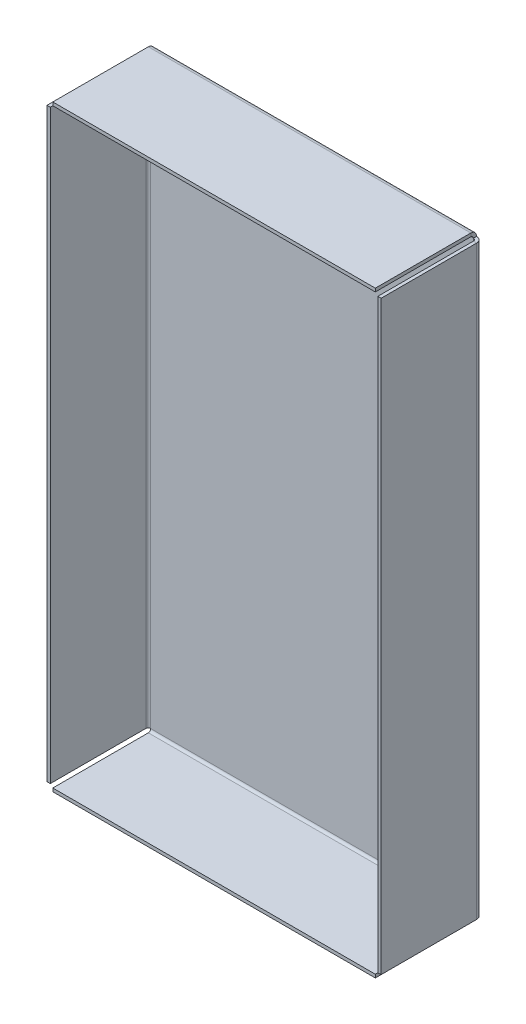
ISO-10303-21;
HEADER;
FILE_DESCRIPTION(('STEP AP214'),'2;1');
FILE_NAME('part.step','',(''),(''),'','','');
FILE_SCHEMA(('AUTOMOTIVE_DESIGN { 1 0 10303 214 1 1 1 1 }'));
ENDSEC;
DATA;
#1=APPLICATION_CONTEXT('core data for automotive mechanical design processes');
#2=APPLICATION_PROTOCOL_DEFINITION('international standard','automotive_design',2000,#1);
#3=PRODUCT_CONTEXT('',#1,'mechanical');
#4=PRODUCT('Part','Part','',(#3));
#5=PRODUCT_RELATED_PRODUCT_CATEGORY('part','',(#4));
#6=PRODUCT_DEFINITION_FORMATION('','',#4);
#7=PRODUCT_DEFINITION_CONTEXT('part definition',#1,'design');
#8=PRODUCT_DEFINITION('design','',#6,#7);
#9=PRODUCT_DEFINITION_SHAPE('','',#8);
#10=(LENGTH_UNIT() NAMED_UNIT(*) SI_UNIT(.MILLI.,.METRE.));
#11=(NAMED_UNIT(*) PLANE_ANGLE_UNIT() SI_UNIT($,.RADIAN.));
#12=(NAMED_UNIT(*) SI_UNIT($,.STERADIAN.) SOLID_ANGLE_UNIT());
#13=UNCERTAINTY_MEASURE_WITH_UNIT(LENGTH_MEASURE(1.E-05),#10,'distance_accuracy_value','');
#14=(GEOMETRIC_REPRESENTATION_CONTEXT(3) GLOBAL_UNCERTAINTY_ASSIGNED_CONTEXT((#13)) GLOBAL_UNIT_ASSIGNED_CONTEXT((#10,
#11,#12)) REPRESENTATION_CONTEXT('',''));
#15=CARTESIAN_POINT('',(0.,0.,0.));
#16=DIRECTION('',(0.,0.,1.));
#17=DIRECTION('',(1.,0.,0.));
#18=AXIS2_PLACEMENT_3D('',#15,#16,#17);
#19=CARTESIAN_POINT('',(0.,0.,-1.));
#20=DIRECTION('',(0.,0.,-1.));
#21=DIRECTION('',(-1.,0.,0.));
#22=AXIS2_PLACEMENT_3D('',#19,#20,#21);
#23=PLANE('',#22);
#24=DIRECTION('',(-1.,0.,0.));
#25=VECTOR('',#24,1.);
#26=CARTESIAN_POINT('',(160.,209.,-1.));
#27=LINE('',#26,#25);
#28=CARTESIAN_POINT('',(129.028776631143,209.,-1.));
#29=VERTEX_POINT('',#28);
#30=CARTESIAN_POINT('',(129.,209.,-1.));
#31=VERTEX_POINT('',#30);
#32=EDGE_CURVE('E61',#29,#31,#27,.T.);
#33=ORIENTED_EDGE('',*,*,#32,.F.);
#34=DIRECTION('',(0.,-1.,0.));
#35=VECTOR('',#34,1.);
#36=CARTESIAN_POINT('',(129.028776631143,0.,-1.));
#37=LINE('',#36,#35);
#38=CARTESIAN_POINT('',(129.028776631143,31.,-1.));
#39=VERTEX_POINT('',#38);
#40=EDGE_CURVE('E483',#29,#39,#37,.T.);
#41=ORIENTED_EDGE('',*,*,#40,.T.);
#42=DIRECTION('',(1.,0.,0.));
#43=VECTOR('',#42,1.);
#44=CARTESIAN_POINT('',(160.,31.,-1.));
#45=LINE('',#44,#43);
#46=CARTESIAN_POINT('',(129.,31.,-1.));
#47=VERTEX_POINT('',#46);
#48=EDGE_CURVE('E429',#47,#39,#45,.T.);
#49=ORIENTED_EDGE('',*,*,#48,.F.);
#50=DIRECTION('',(0.,1.,0.));
#51=VECTOR('',#50,1.);
#52=CARTESIAN_POINT('',(129.,31.,-1.));
#53=LINE('',#52,#51);
#54=CARTESIAN_POINT('',(129.,30.9712233688573,-1.));
#55=VERTEX_POINT('',#54);
#56=EDGE_CURVE('E485',#55,#47,#53,.T.);
#57=ORIENTED_EDGE('',*,*,#56,.F.);
#58=DIRECTION('',(1.,0.,0.));
#59=VECTOR('',#58,1.);
#60=CARTESIAN_POINT('',(0.,30.9712233688573,-1.));
#61=LINE('',#60,#59);
#62=CARTESIAN_POINT('',(31.,30.9712233688573,-1.));
#63=VERTEX_POINT('',#62);
#64=EDGE_CURVE('E465',#63,#55,#61,.T.);
#65=ORIENTED_EDGE('',*,*,#64,.F.);
#66=DIRECTION('',(0.,-1.,0.));
#67=VECTOR('',#66,1.);
#68=CARTESIAN_POINT('',(31.,31.,-1.));
#69=LINE('',#68,#67);
#70=CARTESIAN_POINT('',(31.,31.,-1.));
#71=VERTEX_POINT('',#70);
#72=EDGE_CURVE('E472',#71,#63,#69,.T.);
#73=ORIENTED_EDGE('',*,*,#72,.F.);
#74=DIRECTION('',(1.,0.,0.));
#75=VECTOR('',#74,1.);
#76=CARTESIAN_POINT('',(0.,31.,-1.));
#77=LINE('',#76,#75);
#78=CARTESIAN_POINT('',(30.9712233688573,31.,-1.));
#79=VERTEX_POINT('',#78);
#80=EDGE_CURVE('E467',#79,#71,#77,.T.);
#81=ORIENTED_EDGE('',*,*,#80,.F.);
#82=DIRECTION('',(0.,-1.,0.));
#83=VECTOR('',#82,1.);
#84=CARTESIAN_POINT('',(30.9712233688573,0.,-1.));
#85=LINE('',#84,#83);
#86=CARTESIAN_POINT('',(30.9712233688573,209.,-1.));
#87=VERTEX_POINT('',#86);
#88=EDGE_CURVE('E441',#87,#79,#85,.T.);
#89=ORIENTED_EDGE('',*,*,#88,.F.);
#90=DIRECTION('',(-1.,0.,0.));
#91=VECTOR('',#90,1.);
#92=CARTESIAN_POINT('',(0.,209.,-1.));
#93=LINE('',#92,#91);
#94=CARTESIAN_POINT('',(31.,209.,-1.));
#95=VERTEX_POINT('',#94);
#96=EDGE_CURVE('E453',#95,#87,#93,.T.);
#97=ORIENTED_EDGE('',*,*,#96,.F.);
#98=DIRECTION('',(0.,-1.,0.));
#99=VECTOR('',#98,1.);
#100=CARTESIAN_POINT('',(31.,209.,-1.));
#101=LINE('',#100,#99);
#102=CARTESIAN_POINT('',(31.,209.028776631143,-1.));
#103=VERTEX_POINT('',#102);
#104=EDGE_CURVE('E445',#103,#95,#101,.T.);
#105=ORIENTED_EDGE('',*,*,#104,.F.);
#106=DIRECTION('',(1.,0.,0.));
#107=VECTOR('',#106,1.);
#108=CARTESIAN_POINT('',(0.,209.028776631143,-1.));
#109=LINE('',#108,#107);
#110=CARTESIAN_POINT('',(129.,209.028776631143,-1.));
#111=VERTEX_POINT('',#110);
#112=EDGE_CURVE('E419',#103,#111,#109,.T.);
#113=ORIENTED_EDGE('',*,*,#112,.T.);
#114=DIRECTION('',(0.,1.,0.));
#115=VECTOR('',#114,1.);
#116=CARTESIAN_POINT('',(129.,209.,-1.));
#117=LINE('',#116,#115);
#118=EDGE_CURVE('E442',#31,#111,#117,.T.);
#119=ORIENTED_EDGE('',*,*,#118,.F.);
#120=EDGE_LOOP('',(#33,#41,#49,#57,#65,#73,#81,#89,#97,#105,#113,#119));
#121=FACE_BOUND('',#120,.T.);
#122=ADVANCED_FACE('F57',(#121),#23,.T.);
#123=CARTESIAN_POINT('',(160.,209.,-1.));
#124=DIRECTION('',(0.,1.,0.));
#125=DIRECTION('',(-1.,0.,0.));
#126=AXIS2_PLACEMENT_3D('',#123,#124,#125);
#127=PLANE('',#126);
#128=DIRECTION('',(-1.,0.,0.));
#129=VECTOR('',#128,1.);
#130=CARTESIAN_POINT('',(160.,209.,0.));
#131=LINE('',#130,#129);
#132=CARTESIAN_POINT('',(129.028776631143,209.,0.));
#133=VERTEX_POINT('',#132);
#134=CARTESIAN_POINT('',(129.,209.,0.));
#135=VERTEX_POINT('',#134);
#136=EDGE_CURVE('E412',#133,#135,#131,.T.);
#137=ORIENTED_EDGE('',*,*,#136,.F.);
#138=DIRECTION('',(0.,0.,-1.));
#139=VECTOR('',#138,1.);
#140=CARTESIAN_POINT('',(129.028776631143,209.,-1.));
#141=LINE('',#140,#139);
#142=EDGE_CURVE('E493',#133,#29,#141,.T.);
#143=ORIENTED_EDGE('',*,*,#142,.T.);
#144=ORIENTED_EDGE('',*,*,#32,.T.);
#145=DIRECTION('',(0.,0.,1.));
#146=VECTOR('',#145,1.);
#147=CARTESIAN_POINT('',(129.,209.,-1.));
#148=LINE('',#147,#146);
#149=EDGE_CURVE('E426',#31,#135,#148,.T.);
#150=ORIENTED_EDGE('',*,*,#149,.T.);
#151=EDGE_LOOP('',(#137,#143,#144,#150));
#152=FACE_BOUND('',#151,.T.);
#153=ADVANCED_FACE('F507',(#152),#127,.T.);
#154=CARTESIAN_POINT('',(160.,31.,-1.));
#155=DIRECTION('',(0.,-1.,0.));
#156=DIRECTION('',(0.,0.,-1.));
#157=AXIS2_PLACEMENT_3D('',#154,#155,#156);
#158=PLANE('',#157);
#159=ORIENTED_EDGE('',*,*,#48,.T.);
#160=DIRECTION('',(0.,0.,1.));
#161=VECTOR('',#160,1.);
#162=CARTESIAN_POINT('',(129.028776631143,31.,-1.));
#163=LINE('',#162,#161);
#164=CARTESIAN_POINT('',(129.028776631143,31.,0.));
#165=VERTEX_POINT('',#164);
#166=EDGE_CURVE('E12',#39,#165,#163,.T.);
#167=ORIENTED_EDGE('',*,*,#166,.T.);
#168=DIRECTION('',(1.,0.,0.));
#169=VECTOR('',#168,1.);
#170=CARTESIAN_POINT('',(160.,31.,0.));
#171=LINE('',#170,#169);
#172=CARTESIAN_POINT('',(129.,31.,0.));
#173=VERTEX_POINT('',#172);
#174=EDGE_CURVE('E488',#173,#165,#171,.T.);
#175=ORIENTED_EDGE('',*,*,#174,.F.);
#176=DIRECTION('',(0.,0.,1.));
#177=VECTOR('',#176,1.);
#178=CARTESIAN_POINT('',(129.,31.,-1.));
#179=LINE('',#178,#177);
#180=EDGE_CURVE('E416',#47,#173,#179,.T.);
#181=ORIENTED_EDGE('',*,*,#180,.F.);
#182=EDGE_LOOP('',(#159,#167,#175,#181));
#183=FACE_BOUND('',#182,.T.);
#184=ADVANCED_FACE('F59',(#183),#158,.T.);
#185=CARTESIAN_POINT('',(0.,0.,0.));
#186=DIRECTION('',(0.,0.,-1.));
#187=DIRECTION('',(-1.,0.,0.));
#188=AXIS2_PLACEMENT_3D('',#185,#186,#187);
#189=PLANE('',#188);
#190=DIRECTION('',(0.,-1.,0.));
#191=VECTOR('',#190,1.);
#192=CARTESIAN_POINT('',(129.028776631143,0.,0.));
#193=LINE('',#192,#191);
#194=EDGE_CURVE('E66',#133,#165,#193,.T.);
#195=ORIENTED_EDGE('',*,*,#194,.F.);
#196=ORIENTED_EDGE('',*,*,#136,.T.);
#197=DIRECTION('',(0.,1.,0.));
#198=VECTOR('',#197,1.);
#199=CARTESIAN_POINT('',(129.,209.,0.));
#200=LINE('',#199,#198);
#201=CARTESIAN_POINT('',(129.,209.028776631143,0.));
#202=VERTEX_POINT('',#201);
#203=EDGE_CURVE('E446',#135,#202,#200,.T.);
#204=ORIENTED_EDGE('',*,*,#203,.T.);
#205=DIRECTION('',(1.,0.,0.));
#206=VECTOR('',#205,1.);
#207=CARTESIAN_POINT('',(0.,209.028776631143,0.));
#208=LINE('',#207,#206);
#209=CARTESIAN_POINT('',(31.,209.028776631143,0.));
#210=VERTEX_POINT('',#209);
#211=EDGE_CURVE('E435',#210,#202,#208,.T.);
#212=ORIENTED_EDGE('',*,*,#211,.F.);
#213=DIRECTION('',(0.,-1.,0.));
#214=VECTOR('',#213,1.);
#215=CARTESIAN_POINT('',(31.,209.,0.));
#216=LINE('',#215,#214);
#217=CARTESIAN_POINT('',(31.,209.,0.));
#218=VERTEX_POINT('',#217);
#219=EDGE_CURVE('E449',#210,#218,#216,.T.);
#220=ORIENTED_EDGE('',*,*,#219,.T.);
#221=DIRECTION('',(-1.,0.,0.));
#222=VECTOR('',#221,1.);
#223=CARTESIAN_POINT('',(0.,209.,0.));
#224=LINE('',#223,#222);
#225=CARTESIAN_POINT('',(30.9712233688573,209.,0.));
#226=VERTEX_POINT('',#225);
#227=EDGE_CURVE('E451',#218,#226,#224,.T.);
#228=ORIENTED_EDGE('',*,*,#227,.T.);
#229=DIRECTION('',(0.,-1.,0.));
#230=VECTOR('',#229,1.);
#231=CARTESIAN_POINT('',(30.9712233688573,0.,0.));
#232=LINE('',#231,#230);
#233=CARTESIAN_POINT('',(30.9712233688573,31.,0.));
#234=VERTEX_POINT('',#233);
#235=EDGE_CURVE('E459',#226,#234,#232,.T.);
#236=ORIENTED_EDGE('',*,*,#235,.T.);
#237=DIRECTION('',(1.,0.,0.));
#238=VECTOR('',#237,1.);
#239=CARTESIAN_POINT('',(0.,31.,0.));
#240=LINE('',#239,#238);
#241=CARTESIAN_POINT('',(31.,31.,0.));
#242=VERTEX_POINT('',#241);
#243=EDGE_CURVE('E468',#234,#242,#240,.T.);
#244=ORIENTED_EDGE('',*,*,#243,.T.);
#245=DIRECTION('',(0.,-1.,0.));
#246=VECTOR('',#245,1.);
#247=CARTESIAN_POINT('',(31.,31.,0.));
#248=LINE('',#247,#246);
#249=CARTESIAN_POINT('',(31.,30.9712233688573,0.));
#250=VERTEX_POINT('',#249);
#251=EDGE_CURVE('E82',#242,#250,#248,.T.);
#252=ORIENTED_EDGE('',*,*,#251,.T.);
#253=DIRECTION('',(1.,0.,0.));
#254=VECTOR('',#253,1.);
#255=CARTESIAN_POINT('',(0.,30.9712233688573,0.));
#256=LINE('',#255,#254);
#257=CARTESIAN_POINT('',(129.,30.9712233688573,0.));
#258=VERTEX_POINT('',#257);
#259=EDGE_CURVE('E478',#250,#258,#256,.T.);
#260=ORIENTED_EDGE('',*,*,#259,.T.);
#261=DIRECTION('',(0.,1.,0.));
#262=VECTOR('',#261,1.);
#263=CARTESIAN_POINT('',(129.,31.,0.));
#264=LINE('',#263,#262);
#265=EDGE_CURVE('E486',#258,#173,#264,.T.);
#266=ORIENTED_EDGE('',*,*,#265,.T.);
#267=ORIENTED_EDGE('',*,*,#174,.T.);
#268=EDGE_LOOP('',(#195,#196,#204,#212,#220,#228,#236,#244,#252,#260,#266,#267));
#269=FACE_BOUND('',#268,.T.);
#270=ADVANCED_FACE('F502',(#269),#189,.F.);
#271=CARTESIAN_POINT('',(31.,209.,-1.));
#272=DIRECTION('',(-1.,0.,0.));
#273=DIRECTION('',(0.,0.,1.));
#274=AXIS2_PLACEMENT_3D('',#271,#272,#273);
#275=PLANE('',#274);
#276=ORIENTED_EDGE('',*,*,#219,.F.);
#277=DIRECTION('',(0.,0.,-1.));
#278=VECTOR('',#277,1.);
#279=CARTESIAN_POINT('',(31.,209.028776631143,-1.));
#280=LINE('',#279,#278);
#281=EDGE_CURVE('E432',#210,#103,#280,.T.);
#282=ORIENTED_EDGE('',*,*,#281,.T.);
#283=ORIENTED_EDGE('',*,*,#104,.T.);
#284=DIRECTION('',(0.,0.,1.));
#285=VECTOR('',#284,1.);
#286=CARTESIAN_POINT('',(31.,209.,-1.));
#287=LINE('',#286,#285);
#288=EDGE_CURVE('E423',#95,#218,#287,.T.);
#289=ORIENTED_EDGE('',*,*,#288,.T.);
#290=EDGE_LOOP('',(#276,#282,#283,#289));
#291=FACE_BOUND('',#290,.T.);
#292=ADVANCED_FACE('F526',(#291),#275,.T.);
#293=CARTESIAN_POINT('',(129.,209.,-1.));
#294=DIRECTION('',(1.,0.,0.));
#295=DIRECTION('',(0.,1.,0.));
#296=AXIS2_PLACEMENT_3D('',#293,#294,#295);
#297=PLANE('',#296);
#298=ORIENTED_EDGE('',*,*,#118,.T.);
#299=DIRECTION('',(0.,0.,1.));
#300=VECTOR('',#299,1.);
#301=CARTESIAN_POINT('',(129.,209.028776631143,-1.));
#302=LINE('',#301,#300);
#303=EDGE_CURVE('E438',#111,#202,#302,.T.);
#304=ORIENTED_EDGE('',*,*,#303,.T.);
#305=ORIENTED_EDGE('',*,*,#203,.F.);
#306=ORIENTED_EDGE('',*,*,#149,.F.);
#307=EDGE_LOOP('',(#298,#304,#305,#306));
#308=FACE_BOUND('',#307,.T.);
#309=ADVANCED_FACE('F511',(#308),#297,.T.);
#310=CARTESIAN_POINT('',(129.,31.,-1.));
#311=DIRECTION('',(1.,0.,0.));
#312=DIRECTION('',(0.,1.,0.));
#313=AXIS2_PLACEMENT_3D('',#310,#311,#312);
#314=PLANE('',#313);
#315=DIRECTION('',(0.,0.,1.));
#316=VECTOR('',#315,1.);
#317=CARTESIAN_POINT('',(129.,30.9712233688573,-1.));
#318=LINE('',#317,#316);
#319=EDGE_CURVE('E475',#55,#258,#318,.T.);
#320=ORIENTED_EDGE('',*,*,#319,.F.);
#321=ORIENTED_EDGE('',*,*,#56,.T.);
#322=ORIENTED_EDGE('',*,*,#180,.T.);
#323=ORIENTED_EDGE('',*,*,#265,.F.);
#324=EDGE_LOOP('',(#320,#321,#322,#323));
#325=FACE_BOUND('',#324,.T.);
#326=ADVANCED_FACE('F714',(#325),#314,.T.);
#327=CARTESIAN_POINT('',(31.,31.,-1.));
#328=DIRECTION('',(-1.,0.,0.));
#329=DIRECTION('',(0.,0.,1.));
#330=AXIS2_PLACEMENT_3D('',#327,#328,#329);
#331=PLANE('',#330);
#332=DIRECTION('',(0.,0.,-1.));
#333=VECTOR('',#332,1.);
#334=CARTESIAN_POINT('',(31.,30.9712233688573,-1.));
#335=LINE('',#334,#333);
#336=EDGE_CURVE('E480',#250,#63,#335,.T.);
#337=ORIENTED_EDGE('',*,*,#336,.F.);
#338=ORIENTED_EDGE('',*,*,#251,.F.);
#339=DIRECTION('',(0.,0.,1.));
#340=VECTOR('',#339,1.);
#341=CARTESIAN_POINT('',(31.,31.,-1.));
#342=LINE('',#341,#340);
#343=EDGE_CURVE('E420',#71,#242,#342,.T.);
#344=ORIENTED_EDGE('',*,*,#343,.F.);
#345=ORIENTED_EDGE('',*,*,#72,.T.);
#346=EDGE_LOOP('',(#337,#338,#344,#345));
#347=FACE_BOUND('',#346,.T.);
#348=ADVANCED_FACE('F565',(#347),#331,.T.);
#349=CARTESIAN_POINT('',(0.,31.,-1.));
#350=DIRECTION('',(0.,-1.,0.));
#351=DIRECTION('',(0.,0.,-1.));
#352=AXIS2_PLACEMENT_3D('',#349,#350,#351);
#353=PLANE('',#352);
#354=DIRECTION('',(0.,0.,1.));
#355=VECTOR('',#354,1.);
#356=CARTESIAN_POINT('',(30.9712233688573,31.,-1.));
#357=LINE('',#356,#355);
#358=EDGE_CURVE('E456',#79,#234,#357,.T.);
#359=ORIENTED_EDGE('',*,*,#358,.F.);
#360=ORIENTED_EDGE('',*,*,#80,.T.);
#361=ORIENTED_EDGE('',*,*,#343,.T.);
#362=ORIENTED_EDGE('',*,*,#243,.F.);
#363=EDGE_LOOP('',(#359,#360,#361,#362));
#364=FACE_BOUND('',#363,.T.);
#365=ADVANCED_FACE('F715',(#364),#353,.T.);
#366=CARTESIAN_POINT('',(0.,209.,-1.));
#367=DIRECTION('',(0.,1.,0.));
#368=DIRECTION('',(0.,0.,1.));
#369=AXIS2_PLACEMENT_3D('',#366,#367,#368);
#370=PLANE('',#369);
#371=DIRECTION('',(0.,0.,-1.));
#372=VECTOR('',#371,1.);
#373=CARTESIAN_POINT('',(30.9712233688573,209.,-1.));
#374=LINE('',#373,#372);
#375=EDGE_CURVE('E462',#226,#87,#374,.T.);
#376=ORIENTED_EDGE('',*,*,#375,.F.);
#377=ORIENTED_EDGE('',*,*,#227,.F.);
#378=ORIENTED_EDGE('',*,*,#288,.F.);
#379=ORIENTED_EDGE('',*,*,#96,.T.);
#380=EDGE_LOOP('',(#376,#377,#378,#379));
#381=FACE_BOUND('',#380,.T.);
#382=ADVANCED_FACE('F709',(#381),#370,.T.);
#383=CARTESIAN_POINT('',(31.,209.028776631143,0.7366));
#384=DIRECTION('',(-1.,0.,0.));
#385=DIRECTION('',(0.,0.,1.));
#386=AXIS2_PLACEMENT_3D('',#383,#384,#385);
#387=PLANE('',#386);
#388=ORIENTED_EDGE('',*,*,#281,.F.);
#389=CARTESIAN_POINT('',(31.,209.028776631143,0.7366));
#390=DIRECTION('',(1.,0.,0.));
#391=DIRECTION('',(0.,0.,-1.));
#392=AXIS2_PLACEMENT_3D('',#389,#390,#391);
#393=CIRCLE('',#392,0.7366);
#394=CARTESIAN_POINT('',(31.,209.765376631143,0.736600000000004));
#395=VERTEX_POINT('',#394);
#396=EDGE_CURVE('E376',#210,#395,#393,.T.);
#397=ORIENTED_EDGE('',*,*,#396,.T.);
#398=DIRECTION('',(0.,1.,0.));
#399=VECTOR('',#398,1.);
#400=CARTESIAN_POINT('',(31.,210.765376631143,0.736600000000004));
#401=LINE('',#400,#399);
#402=CARTESIAN_POINT('',(31.,210.765376631143,0.736600000000004));
#403=VERTEX_POINT('',#402);
#404=EDGE_CURVE('E397',#395,#403,#401,.T.);
#405=ORIENTED_EDGE('',*,*,#404,.T.);
#406=CARTESIAN_POINT('',(31.,209.028776631143,0.7366));
#407=DIRECTION('',(1.,0.,0.));
#408=DIRECTION('',(0.,0.,1.));
#409=AXIS2_PLACEMENT_3D('',#406,#407,#408);
#410=CIRCLE('',#409,1.7366);
#411=EDGE_CURVE('E405',#103,#403,#410,.T.);
#412=ORIENTED_EDGE('',*,*,#411,.F.);
#413=EDGE_LOOP('',(#388,#397,#405,#412));
#414=FACE_BOUND('',#413,.T.);
#415=ADVANCED_FACE('F529',(#414),#387,.T.);
#416=CARTESIAN_POINT('',(129.,209.028776631143,0.7366));
#417=DIRECTION('',(1.,0.,0.));
#418=DIRECTION('',(0.,0.,-1.));
#419=AXIS2_PLACEMENT_3D('',#416,#417,#418);
#420=PLANE('',#419);
#421=CARTESIAN_POINT('',(129.,209.028776631143,0.7366));
#422=DIRECTION('',(1.,0.,0.));
#423=DIRECTION('',(0.,0.,-1.));
#424=AXIS2_PLACEMENT_3D('',#421,#422,#423);
#425=CIRCLE('',#424,0.7366);
#426=CARTESIAN_POINT('',(129.,209.765376631143,0.736600000000004));
#427=VERTEX_POINT('',#426);
#428=EDGE_CURVE('E409',#427,#202,#425,.F.);
#429=ORIENTED_EDGE('',*,*,#428,.T.);
#430=ORIENTED_EDGE('',*,*,#303,.F.);
#431=CARTESIAN_POINT('',(129.,209.028776631143,0.7366));
#432=DIRECTION('',(-1.,0.,0.));
#433=DIRECTION('',(0.,0.,-1.));
#434=AXIS2_PLACEMENT_3D('',#431,#432,#433);
#435=CIRCLE('',#434,1.7366);
#436=CARTESIAN_POINT('',(129.,210.765376631143,0.736600000000041));
#437=VERTEX_POINT('',#436);
#438=EDGE_CURVE('E408',#437,#111,#435,.T.);
#439=ORIENTED_EDGE('',*,*,#438,.F.);
#440=DIRECTION('',(0.,-1.,0.));
#441=VECTOR('',#440,1.);
#442=CARTESIAN_POINT('',(129.,210.765376631143,0.736600000000004));
#443=LINE('',#442,#441);
#444=EDGE_CURVE('E400',#437,#427,#443,.T.);
#445=ORIENTED_EDGE('',*,*,#444,.T.);
#446=EDGE_LOOP('',(#429,#430,#439,#445));
#447=FACE_BOUND('',#446,.T.);
#448=ADVANCED_FACE('F514',(#447),#420,.T.);
#449=CARTESIAN_POINT('',(-18.0243495226,209.028776631143,0.7366));
#450=DIRECTION('',(1.,0.,0.));
#451=DIRECTION('',(0.,0.,-1.));
#452=AXIS2_PLACEMENT_3D('',#449,#450,#451);
#453=CYLINDRICAL_SURFACE('',#452,1.7366);
#454=DIRECTION('',(1.,0.,0.));
#455=VECTOR('',#454,1.);
#456=CARTESIAN_POINT('',(0.,210.765376631143,0.736600000000004));
#457=LINE('',#456,#455);
#458=EDGE_CURVE('E368',#403,#437,#457,.T.);
#459=ORIENTED_EDGE('',*,*,#458,.T.);
#460=ORIENTED_EDGE('',*,*,#438,.T.);
#461=ORIENTED_EDGE('',*,*,#112,.F.);
#462=ORIENTED_EDGE('',*,*,#411,.T.);
#463=EDGE_LOOP('',(#459,#460,#461,#462));
#464=FACE_BOUND('',#463,.T.);
#465=ADVANCED_FACE('F517',(#464),#453,.T.);
#466=CARTESIAN_POINT('',(-18.0243495226,209.028776631143,0.7366));
#467=DIRECTION('',(1.,0.,0.));
#468=DIRECTION('',(0.,0.,-1.));
#469=AXIS2_PLACEMENT_3D('',#466,#467,#468);
#470=CYLINDRICAL_SURFACE('',#469,0.7366);
#471=DIRECTION('',(1.,0.,0.));
#472=VECTOR('',#471,1.);
#473=CARTESIAN_POINT('',(0.,209.765376631143,0.736600000000004));
#474=LINE('',#473,#472);
#475=EDGE_CURVE('E384',#395,#427,#474,.T.);
#476=ORIENTED_EDGE('',*,*,#475,.F.);
#477=ORIENTED_EDGE('',*,*,#396,.F.);
#478=ORIENTED_EDGE('',*,*,#211,.T.);
#479=ORIENTED_EDGE('',*,*,#428,.F.);
#480=EDGE_LOOP('',(#476,#477,#478,#479));
#481=FACE_BOUND('',#480,.T.);
#482=ADVANCED_FACE('F532',(#481),#470,.F.);
#483=CARTESIAN_POINT('',(31.,210.765376631143,29.7653766311427));
#484=DIRECTION('',(0.,0.,1.));
#485=DIRECTION('',(0.,-1.,0.));
#486=AXIS2_PLACEMENT_3D('',#483,#484,#485);
#487=PLANE('',#486);
#488=DIRECTION('',(-1.,0.,0.));
#489=VECTOR('',#488,1.);
#490=CARTESIAN_POINT('',(31.,209.765376631143,29.7653766311427));
#491=LINE('',#490,#489);
#492=CARTESIAN_POINT('',(129.,209.765376631143,29.7653766311427));
#493=VERTEX_POINT('',#492);
#494=CARTESIAN_POINT('',(31.,209.765376631143,29.7653766311427));
#495=VERTEX_POINT('',#494);
#496=EDGE_CURVE('E379',#493,#495,#491,.T.);
#497=ORIENTED_EDGE('',*,*,#496,.F.);
#498=DIRECTION('',(0.,-1.,0.));
#499=VECTOR('',#498,1.);
#500=CARTESIAN_POINT('',(129.,210.765376631143,29.7653766311427));
#501=LINE('',#500,#499);
#502=CARTESIAN_POINT('',(129.,210.765376631143,29.7653766311427));
#503=VERTEX_POINT('',#502);
#504=EDGE_CURVE('E373',#503,#493,#501,.T.);
#505=ORIENTED_EDGE('',*,*,#504,.F.);
#506=DIRECTION('',(-1.,0.,0.));
#507=VECTOR('',#506,1.);
#508=CARTESIAN_POINT('',(31.,210.765376631143,29.7653766311427));
#509=LINE('',#508,#507);
#510=CARTESIAN_POINT('',(31.,210.765376631143,29.7653766311427));
#511=VERTEX_POINT('',#510);
#512=EDGE_CURVE('E394',#503,#511,#509,.T.);
#513=ORIENTED_EDGE('',*,*,#512,.T.);
#514=DIRECTION('',(0.,-1.,0.));
#515=VECTOR('',#514,1.);
#516=CARTESIAN_POINT('',(31.,210.765376631143,29.7653766311427));
#517=LINE('',#516,#515);
#518=EDGE_CURVE('E392',#511,#495,#517,.T.);
#519=ORIENTED_EDGE('',*,*,#518,.T.);
#520=EDGE_LOOP('',(#497,#505,#513,#519));
#521=FACE_BOUND('',#520,.T.);
#522=ADVANCED_FACE('F547',(#521),#487,.T.);
#523=CARTESIAN_POINT('',(0.,210.765376631143,-210.234623368857));
#524=DIRECTION('',(0.,1.,0.));
#525=DIRECTION('',(-1.,0.,0.));
#526=AXIS2_PLACEMENT_3D('',#523,#524,#525);
#527=PLANE('',#526);
#528=ORIENTED_EDGE('',*,*,#458,.F.);
#529=DIRECTION('',(0.,0.,-1.));
#530=VECTOR('',#529,1.);
#531=CARTESIAN_POINT('',(31.,210.765376631143,-1.2346233688573));
#532=LINE('',#531,#530);
#533=EDGE_CURVE('E389',#511,#403,#532,.T.);
#534=ORIENTED_EDGE('',*,*,#533,.F.);
#535=ORIENTED_EDGE('',*,*,#512,.F.);
#536=DIRECTION('',(0.,0.,1.));
#537=VECTOR('',#536,1.);
#538=CARTESIAN_POINT('',(129.,210.765376631143,-1.2346233688573));
#539=LINE('',#538,#537);
#540=EDGE_CURVE('E377',#437,#503,#539,.T.);
#541=ORIENTED_EDGE('',*,*,#540,.F.);
#542=EDGE_LOOP('',(#528,#534,#535,#541));
#543=FACE_BOUND('',#542,.T.);
#544=ADVANCED_FACE('F543',(#543),#527,.T.);
#545=CARTESIAN_POINT('',(31.,210.765376631143,-1.2346233688573));
#546=DIRECTION('',(-1.,0.,0.));
#547=DIRECTION('',(0.,-1.,0.));
#548=AXIS2_PLACEMENT_3D('',#545,#546,#547);
#549=PLANE('',#548);
#550=ORIENTED_EDGE('',*,*,#404,.F.);
#551=DIRECTION('',(0.,0.,-1.));
#552=VECTOR('',#551,1.);
#553=CARTESIAN_POINT('',(31.,209.765376631143,-1.2346233688573));
#554=LINE('',#553,#552);
#555=EDGE_CURVE('E387',#495,#395,#554,.T.);
#556=ORIENTED_EDGE('',*,*,#555,.F.);
#557=ORIENTED_EDGE('',*,*,#518,.F.);
#558=ORIENTED_EDGE('',*,*,#533,.T.);
#559=EDGE_LOOP('',(#550,#556,#557,#558));
#560=FACE_BOUND('',#559,.T.);
#561=ADVANCED_FACE('F549',(#560),#549,.T.);
#562=CARTESIAN_POINT('',(0.,209.765376631143,-210.234623368857));
#563=DIRECTION('',(0.,1.,0.));
#564=DIRECTION('',(-1.,0.,0.));
#565=AXIS2_PLACEMENT_3D('',#562,#563,#564);
#566=PLANE('',#565);
#567=ORIENTED_EDGE('',*,*,#555,.T.);
#568=ORIENTED_EDGE('',*,*,#475,.T.);
#569=DIRECTION('',(0.,0.,1.));
#570=VECTOR('',#569,1.);
#571=CARTESIAN_POINT('',(129.,209.765376631143,-1.2346233688573));
#572=LINE('',#571,#570);
#573=EDGE_CURVE('E382',#427,#493,#572,.T.);
#574=ORIENTED_EDGE('',*,*,#573,.T.);
#575=ORIENTED_EDGE('',*,*,#496,.T.);
#576=EDGE_LOOP('',(#567,#568,#574,#575));
#577=FACE_BOUND('',#576,.T.);
#578=ADVANCED_FACE('F534',(#577),#566,.F.);
#579=CARTESIAN_POINT('',(129.,210.765376631143,-1.2346233688573));
#580=DIRECTION('',(1.,0.,0.));
#581=DIRECTION('',(0.,0.,1.));
#582=AXIS2_PLACEMENT_3D('',#579,#580,#581);
#583=PLANE('',#582);
#584=ORIENTED_EDGE('',*,*,#444,.F.);
#585=ORIENTED_EDGE('',*,*,#540,.T.);
#586=ORIENTED_EDGE('',*,*,#504,.T.);
#587=ORIENTED_EDGE('',*,*,#573,.F.);
#588=EDGE_LOOP('',(#584,#585,#586,#587));
#589=FACE_BOUND('',#588,.T.);
#590=ADVANCED_FACE('F539',(#589),#583,.T.);
#591=CARTESIAN_POINT('',(30.9712233688573,209.,0.7366));
#592=DIRECTION('',(0.,1.,0.));
#593=DIRECTION('',(0.,0.,1.));
#594=AXIS2_PLACEMENT_3D('',#591,#592,#593);
#595=PLANE('',#594);
#596=DIRECTION('',(-1.,0.,0.));
#597=VECTOR('',#596,1.);
#598=CARTESIAN_POINT('',(29.2346233688573,209.,0.736600000000018));
#599=LINE('',#598,#597);
#600=CARTESIAN_POINT('',(30.2346233688573,209.,0.736600000000004));
#601=VERTEX_POINT('',#600);
#602=CARTESIAN_POINT('',(29.2346233688573,209.,0.736599999999987));
#603=VERTEX_POINT('',#602);
#604=EDGE_CURVE('E337',#601,#603,#599,.T.);
#605=ORIENTED_EDGE('',*,*,#604,.F.);
#606=CARTESIAN_POINT('',(30.9712233688573,209.,0.7366));
#607=DIRECTION('',(0.,1.,0.));
#608=DIRECTION('',(-1.,0.,0.));
#609=AXIS2_PLACEMENT_3D('',#606,#607,#608);
#610=CIRCLE('',#609,0.7366);
#611=EDGE_CURVE('E334',#601,#226,#610,.F.);
#612=ORIENTED_EDGE('',*,*,#611,.T.);
#613=ORIENTED_EDGE('',*,*,#375,.T.);
#614=CARTESIAN_POINT('',(30.9712233688573,209.,0.7366));
#615=DIRECTION('',(0.,-1.,0.));
#616=DIRECTION('',(0.,0.,1.));
#617=AXIS2_PLACEMENT_3D('',#614,#615,#616);
#618=CIRCLE('',#617,1.7366);
#619=EDGE_CURVE('E361',#603,#87,#618,.T.);
#620=ORIENTED_EDGE('',*,*,#619,.F.);
#621=EDGE_LOOP('',(#605,#612,#613,#620));
#622=FACE_BOUND('',#621,.T.);
#623=ADVANCED_FACE('F689',(#622),#595,.T.);
#624=CARTESIAN_POINT('',(30.9712233688573,31.,0.7366));
#625=DIRECTION('',(0.,-1.,0.));
#626=DIRECTION('',(0.,0.,-1.));
#627=AXIS2_PLACEMENT_3D('',#624,#625,#626);
#628=PLANE('',#627);
#629=CARTESIAN_POINT('',(30.9712233688573,31.,0.7366));
#630=DIRECTION('',(0.,1.,0.));
#631=DIRECTION('',(-1.,0.,0.));
#632=AXIS2_PLACEMENT_3D('',#629,#630,#631);
#633=CIRCLE('',#632,0.7366);
#634=CARTESIAN_POINT('',(30.2346233688573,31.,0.736600000000025));
#635=VERTEX_POINT('',#634);
#636=EDGE_CURVE('E365',#234,#635,#633,.T.);
#637=ORIENTED_EDGE('',*,*,#636,.T.);
#638=DIRECTION('',(1.,0.,0.));
#639=VECTOR('',#638,1.);
#640=CARTESIAN_POINT('',(29.2346233688573,31.,0.736600000000018));
#641=LINE('',#640,#639);
#642=CARTESIAN_POINT('',(29.2346233688573,31.,0.736600000000028));
#643=VERTEX_POINT('',#642);
#644=EDGE_CURVE('E346',#643,#635,#641,.T.);
#645=ORIENTED_EDGE('',*,*,#644,.F.);
#646=CARTESIAN_POINT('',(30.9712233688573,31.,0.7366));
#647=DIRECTION('',(0.,1.,0.));
#648=DIRECTION('',(0.,0.,-1.));
#649=AXIS2_PLACEMENT_3D('',#646,#647,#648);
#650=CIRCLE('',#649,1.7366);
#651=EDGE_CURVE('E364',#79,#643,#650,.T.);
#652=ORIENTED_EDGE('',*,*,#651,.F.);
#653=ORIENTED_EDGE('',*,*,#358,.T.);
#654=EDGE_LOOP('',(#637,#645,#652,#653));
#655=FACE_BOUND('',#654,.T.);
#656=ADVANCED_FACE('F684',(#655),#628,.T.);
#657=CARTESIAN_POINT('',(30.9712233688573,-58.0134070774695,0.7366));
#658=DIRECTION('',(0.,1.,0.));
#659=DIRECTION('',(-1.,0.,0.));
#660=AXIS2_PLACEMENT_3D('',#657,#658,#659);
#661=CYLINDRICAL_SURFACE('',#660,1.7366);
#662=ORIENTED_EDGE('',*,*,#88,.T.);
#663=ORIENTED_EDGE('',*,*,#651,.T.);
#664=DIRECTION('',(0.,-1.,0.));
#665=VECTOR('',#664,1.);
#666=CARTESIAN_POINT('',(29.2346233688573,0.,0.736600000000018));
#667=LINE('',#666,#665);
#668=EDGE_CURVE('E352',#603,#643,#667,.T.);
#669=ORIENTED_EDGE('',*,*,#668,.F.);
#670=ORIENTED_EDGE('',*,*,#619,.T.);
#671=EDGE_LOOP('',(#662,#663,#669,#670));
#672=FACE_BOUND('',#671,.T.);
#673=ADVANCED_FACE('F681',(#672),#661,.T.);
#674=CARTESIAN_POINT('',(30.9712233688573,-58.0134070774695,0.7366));
#675=DIRECTION('',(0.,1.,0.));
#676=DIRECTION('',(-1.,0.,0.));
#677=AXIS2_PLACEMENT_3D('',#674,#675,#676);
#678=CYLINDRICAL_SURFACE('',#677,0.7366);
#679=ORIENTED_EDGE('',*,*,#235,.F.);
#680=ORIENTED_EDGE('',*,*,#611,.F.);
#681=DIRECTION('',(0.,-1.,0.));
#682=VECTOR('',#681,1.);
#683=CARTESIAN_POINT('',(30.2346233688573,0.,0.736600000000014));
#684=LINE('',#683,#682);
#685=EDGE_CURVE('E326',#601,#635,#684,.T.);
#686=ORIENTED_EDGE('',*,*,#685,.T.);
#687=ORIENTED_EDGE('',*,*,#636,.F.);
#688=EDGE_LOOP('',(#679,#680,#686,#687));
#689=FACE_BOUND('',#688,.T.);
#690=ADVANCED_FACE('F665',(#689),#678,.F.);
#691=CARTESIAN_POINT('',(29.2346233688574,31.,29.7653766311428));
#692=DIRECTION('',(0.,0.,1.));
#693=DIRECTION('',(1.,0.,0.));
#694=AXIS2_PLACEMENT_3D('',#691,#692,#693);
#695=PLANE('',#694);
#696=DIRECTION('',(0.,-1.,0.));
#697=VECTOR('',#696,1.);
#698=CARTESIAN_POINT('',(30.2346233688574,31.,29.7653766311428));
#699=LINE('',#698,#697);
#700=CARTESIAN_POINT('',(30.2346233688574,209.,29.7653766311427));
#701=VERTEX_POINT('',#700);
#702=CARTESIAN_POINT('',(30.2346233688574,31.,29.7653766311428));
#703=VERTEX_POINT('',#702);
#704=EDGE_CURVE('E341',#701,#703,#699,.T.);
#705=ORIENTED_EDGE('',*,*,#704,.F.);
#706=DIRECTION('',(1.,0.,0.));
#707=VECTOR('',#706,1.);
#708=CARTESIAN_POINT('',(29.2346233688574,209.,29.7653766311427));
#709=LINE('',#708,#707);
#710=CARTESIAN_POINT('',(29.2346233688574,209.,29.7653766311427));
#711=VERTEX_POINT('',#710);
#712=EDGE_CURVE('E331',#711,#701,#709,.T.);
#713=ORIENTED_EDGE('',*,*,#712,.F.);
#714=DIRECTION('',(0.,-1.,0.));
#715=VECTOR('',#714,1.);
#716=CARTESIAN_POINT('',(29.2346233688574,31.,29.7653766311428));
#717=LINE('',#716,#715);
#718=CARTESIAN_POINT('',(29.2346233688574,31.,29.7653766311428));
#719=VERTEX_POINT('',#718);
#720=EDGE_CURVE('E356',#711,#719,#717,.T.);
#721=ORIENTED_EDGE('',*,*,#720,.T.);
#722=DIRECTION('',(1.,0.,0.));
#723=VECTOR('',#722,1.);
#724=CARTESIAN_POINT('',(29.2346233688574,31.,29.7653766311428));
#725=LINE('',#724,#723);
#726=EDGE_CURVE('E354',#719,#703,#725,.T.);
#727=ORIENTED_EDGE('',*,*,#726,.T.);
#728=EDGE_LOOP('',(#705,#713,#721,#727));
#729=FACE_BOUND('',#728,.T.);
#730=ADVANCED_FACE('F661',(#729),#695,.T.);
#731=CARTESIAN_POINT('',(29.2346233688574,0.,29.7653766311428));
#732=DIRECTION('',(-1.,0.,0.));
#733=DIRECTION('',(0.,0.,1.));
#734=AXIS2_PLACEMENT_3D('',#731,#732,#733);
#735=PLANE('',#734);
#736=DIRECTION('',(0.,0.,1.));
#737=VECTOR('',#736,1.);
#738=CARTESIAN_POINT('',(29.2346233688574,209.,29.7653766311427));
#739=LINE('',#738,#737);
#740=EDGE_CURVE('E335',#603,#711,#739,.T.);
#741=ORIENTED_EDGE('',*,*,#740,.F.);
#742=ORIENTED_EDGE('',*,*,#668,.T.);
#743=DIRECTION('',(0.,0.,-1.));
#744=VECTOR('',#743,1.);
#745=CARTESIAN_POINT('',(29.2346233688574,31.,29.7653766311428));
#746=LINE('',#745,#744);
#747=EDGE_CURVE('E349',#719,#643,#746,.T.);
#748=ORIENTED_EDGE('',*,*,#747,.F.);
#749=ORIENTED_EDGE('',*,*,#720,.F.);
#750=EDGE_LOOP('',(#741,#742,#748,#749));
#751=FACE_BOUND('',#750,.T.);
#752=ADVANCED_FACE('F664',(#751),#735,.T.);
#753=CARTESIAN_POINT('',(29.2346233688574,31.,29.7653766311428));
#754=DIRECTION('',(0.,-1.,0.));
#755=DIRECTION('',(-1.,0.,0.));
#756=AXIS2_PLACEMENT_3D('',#753,#754,#755);
#757=PLANE('',#756);
#758=ORIENTED_EDGE('',*,*,#747,.T.);
#759=ORIENTED_EDGE('',*,*,#644,.T.);
#760=DIRECTION('',(0.,0.,-1.));
#761=VECTOR('',#760,1.);
#762=CARTESIAN_POINT('',(30.2346233688574,31.,29.7653766311428));
#763=LINE('',#762,#761);
#764=EDGE_CURVE('E339',#703,#635,#763,.T.);
#765=ORIENTED_EDGE('',*,*,#764,.F.);
#766=ORIENTED_EDGE('',*,*,#726,.F.);
#767=EDGE_LOOP('',(#758,#759,#765,#766));
#768=FACE_BOUND('',#767,.T.);
#769=ADVANCED_FACE('F669',(#768),#757,.T.);
#770=CARTESIAN_POINT('',(30.2346233688574,0.,29.7653766311428));
#771=DIRECTION('',(-1.,0.,0.));
#772=DIRECTION('',(0.,0.,1.));
#773=AXIS2_PLACEMENT_3D('',#770,#771,#772);
#774=PLANE('',#773);
#775=ORIENTED_EDGE('',*,*,#685,.F.);
#776=DIRECTION('',(0.,0.,1.));
#777=VECTOR('',#776,1.);
#778=CARTESIAN_POINT('',(30.2346233688574,209.,29.7653766311427));
#779=LINE('',#778,#777);
#780=EDGE_CURVE('E344',#601,#701,#779,.T.);
#781=ORIENTED_EDGE('',*,*,#780,.T.);
#782=ORIENTED_EDGE('',*,*,#704,.T.);
#783=ORIENTED_EDGE('',*,*,#764,.T.);
#784=EDGE_LOOP('',(#775,#781,#782,#783));
#785=FACE_BOUND('',#784,.T.);
#786=ADVANCED_FACE('F673',(#785),#774,.F.);
#787=CARTESIAN_POINT('',(29.2346233688574,209.,29.7653766311427));
#788=DIRECTION('',(0.,1.,0.));
#789=DIRECTION('',(1.,0.,0.));
#790=AXIS2_PLACEMENT_3D('',#787,#788,#789);
#791=PLANE('',#790);
#792=ORIENTED_EDGE('',*,*,#780,.F.);
#793=ORIENTED_EDGE('',*,*,#604,.T.);
#794=ORIENTED_EDGE('',*,*,#740,.T.);
#795=ORIENTED_EDGE('',*,*,#712,.T.);
#796=EDGE_LOOP('',(#792,#793,#794,#795));
#797=FACE_BOUND('',#796,.T.);
#798=ADVANCED_FACE('F656',(#797),#791,.T.);
#799=CARTESIAN_POINT('',(31.,30.9712233688573,0.7366));
#800=DIRECTION('',(-1.,0.,0.));
#801=DIRECTION('',(0.,0.,1.));
#802=AXIS2_PLACEMENT_3D('',#799,#800,#801);
#803=PLANE('',#802);
#804=DIRECTION('',(0.,-1.,0.));
#805=VECTOR('',#804,1.);
#806=CARTESIAN_POINT('',(31.,29.2346233688573,0.736600000000007));
#807=LINE('',#806,#805);
#808=CARTESIAN_POINT('',(31.,30.2346233688573,0.736600000000011));
#809=VERTEX_POINT('',#808);
#810=CARTESIAN_POINT('',(31.,29.2346233688573,0.736599999999997));
#811=VERTEX_POINT('',#810);
#812=EDGE_CURVE('E295',#809,#811,#807,.T.);
#813=ORIENTED_EDGE('',*,*,#812,.F.);
#814=CARTESIAN_POINT('',(31.,30.9712233688573,0.7366));
#815=DIRECTION('',(-1.,0.,0.));
#816=DIRECTION('',(0.,0.,1.));
#817=AXIS2_PLACEMENT_3D('',#814,#815,#816);
#818=CIRCLE('',#817,0.7366);
#819=EDGE_CURVE('E292',#809,#250,#818,.F.);
#820=ORIENTED_EDGE('',*,*,#819,.T.);
#821=ORIENTED_EDGE('',*,*,#336,.T.);
#822=CARTESIAN_POINT('',(31.,30.9712233688573,0.7366));
#823=DIRECTION('',(1.,0.,0.));
#824=DIRECTION('',(0.,0.,1.));
#825=AXIS2_PLACEMENT_3D('',#822,#823,#824);
#826=CIRCLE('',#825,1.7366);
#827=EDGE_CURVE('E319',#811,#63,#826,.T.);
#828=ORIENTED_EDGE('',*,*,#827,.F.);
#829=EDGE_LOOP('',(#813,#820,#821,#828));
#830=FACE_BOUND('',#829,.T.);
#831=ADVANCED_FACE('F653',(#830),#803,.T.);
#832=CARTESIAN_POINT('',(129.,30.9712233688573,0.7366));
#833=DIRECTION('',(1.,0.,0.));
#834=DIRECTION('',(0.,0.,-1.));
#835=AXIS2_PLACEMENT_3D('',#832,#833,#834);
#836=PLANE('',#835);
#837=CARTESIAN_POINT('',(129.,30.9712233688573,0.7366));
#838=DIRECTION('',(-1.,0.,0.));
#839=DIRECTION('',(0.,0.,1.));
#840=AXIS2_PLACEMENT_3D('',#837,#838,#839);
#841=CIRCLE('',#840,0.7366);
#842=CARTESIAN_POINT('',(129.,30.2346233688573,0.736600000000011));
#843=VERTEX_POINT('',#842);
#844=EDGE_CURVE('E323',#258,#843,#841,.T.);
#845=ORIENTED_EDGE('',*,*,#844,.T.);
#846=DIRECTION('',(0.,1.,0.));
#847=VECTOR('',#846,1.);
#848=CARTESIAN_POINT('',(129.,29.2346233688573,0.736600000000007));
#849=LINE('',#848,#847);
#850=CARTESIAN_POINT('',(129.,29.2346233688573,0.736600000000007));
#851=VERTEX_POINT('',#850);
#852=EDGE_CURVE('E304',#851,#843,#849,.T.);
#853=ORIENTED_EDGE('',*,*,#852,.F.);
#854=CARTESIAN_POINT('',(129.,30.9712233688573,0.7366));
#855=DIRECTION('',(-1.,0.,0.));
#856=DIRECTION('',(0.,0.,-1.));
#857=AXIS2_PLACEMENT_3D('',#854,#855,#856);
#858=CIRCLE('',#857,1.7366);
#859=EDGE_CURVE('E322',#55,#851,#858,.T.);
#860=ORIENTED_EDGE('',*,*,#859,.F.);
#861=ORIENTED_EDGE('',*,*,#319,.T.);
#862=EDGE_LOOP('',(#845,#853,#860,#861));
#863=FACE_BOUND('',#862,.T.);
#864=ADVANCED_FACE('F648',(#863),#836,.T.);
#865=CARTESIAN_POINT('',(178.0243495226,30.9712233688573,0.7366));
#866=DIRECTION('',(-1.,0.,0.));
#867=DIRECTION('',(0.,0.,1.));
#868=AXIS2_PLACEMENT_3D('',#865,#866,#867);
#869=CYLINDRICAL_SURFACE('',#868,1.7366);
#870=ORIENTED_EDGE('',*,*,#64,.T.);
#871=ORIENTED_EDGE('',*,*,#859,.T.);
#872=DIRECTION('',(1.,0.,0.));
#873=VECTOR('',#872,1.);
#874=CARTESIAN_POINT('',(0.,29.2346233688573,0.736600000000007));
#875=LINE('',#874,#873);
#876=EDGE_CURVE('E310',#811,#851,#875,.T.);
#877=ORIENTED_EDGE('',*,*,#876,.F.);
#878=ORIENTED_EDGE('',*,*,#827,.T.);
#879=EDGE_LOOP('',(#870,#871,#877,#878));
#880=FACE_BOUND('',#879,.T.);
#881=ADVANCED_FACE('F645',(#880),#869,.T.);
#882=CARTESIAN_POINT('',(178.0243495226,30.9712233688573,0.7366));
#883=DIRECTION('',(-1.,0.,0.));
#884=DIRECTION('',(0.,0.,1.));
#885=AXIS2_PLACEMENT_3D('',#882,#883,#884);
#886=CYLINDRICAL_SURFACE('',#885,0.7366);
#887=ORIENTED_EDGE('',*,*,#259,.F.);
#888=ORIENTED_EDGE('',*,*,#819,.F.);
#889=DIRECTION('',(1.,0.,0.));
#890=VECTOR('',#889,1.);
#891=CARTESIAN_POINT('',(0.,30.2346233688573,0.736600000000011));
#892=LINE('',#891,#890);
#893=EDGE_CURVE('E285',#809,#843,#892,.T.);
#894=ORIENTED_EDGE('',*,*,#893,.T.);
#895=ORIENTED_EDGE('',*,*,#844,.F.);
#896=EDGE_LOOP('',(#887,#888,#894,#895));
#897=FACE_BOUND('',#896,.T.);
#898=ADVANCED_FACE('F629',(#897),#886,.F.);
#899=CARTESIAN_POINT('',(31.,29.2346233688574,29.7653766311427));
#900=DIRECTION('',(0.,0.,1.));
#901=DIRECTION('',(0.,-1.,0.));
#902=AXIS2_PLACEMENT_3D('',#899,#900,#901);
#903=PLANE('',#902);
#904=DIRECTION('',(1.,0.,0.));
#905=VECTOR('',#904,1.);
#906=CARTESIAN_POINT('',(31.,30.2346233688574,29.7653766311427));
#907=LINE('',#906,#905);
#908=CARTESIAN_POINT('',(31.,30.2346233688574,29.7653766311427));
#909=VERTEX_POINT('',#908);
#910=CARTESIAN_POINT('',(129.,30.2346233688574,29.7653766311427));
#911=VERTEX_POINT('',#910);
#912=EDGE_CURVE('E299',#909,#911,#907,.T.);
#913=ORIENTED_EDGE('',*,*,#912,.F.);
#914=DIRECTION('',(0.,1.,0.));
#915=VECTOR('',#914,1.);
#916=CARTESIAN_POINT('',(31.,29.2346233688574,29.7653766311427));
#917=LINE('',#916,#915);
#918=CARTESIAN_POINT('',(31.,29.2346233688574,29.7653766311427));
#919=VERTEX_POINT('',#918);
#920=EDGE_CURVE('E289',#919,#909,#917,.T.);
#921=ORIENTED_EDGE('',*,*,#920,.F.);
#922=DIRECTION('',(1.,0.,0.));
#923=VECTOR('',#922,1.);
#924=CARTESIAN_POINT('',(31.,29.2346233688574,29.7653766311427));
#925=LINE('',#924,#923);
#926=CARTESIAN_POINT('',(129.,29.2346233688574,29.7653766311427));
#927=VERTEX_POINT('',#926);
#928=EDGE_CURVE('E314',#919,#927,#925,.T.);
#929=ORIENTED_EDGE('',*,*,#928,.T.);
#930=DIRECTION('',(0.,1.,0.));
#931=VECTOR('',#930,1.);
#932=CARTESIAN_POINT('',(129.,29.2346233688574,29.7653766311427));
#933=LINE('',#932,#931);
#934=EDGE_CURVE('E312',#927,#911,#933,.T.);
#935=ORIENTED_EDGE('',*,*,#934,.T.);
#936=EDGE_LOOP('',(#913,#921,#929,#935));
#937=FACE_BOUND('',#936,.T.);
#938=ADVANCED_FACE('F625',(#937),#903,.T.);
#939=CARTESIAN_POINT('',(0.,29.2346233688574,29.7653766311427));
#940=DIRECTION('',(0.,-1.,0.));
#941=DIRECTION('',(-1.,0.,0.));
#942=AXIS2_PLACEMENT_3D('',#939,#940,#941);
#943=PLANE('',#942);
#944=DIRECTION('',(0.,0.,1.));
#945=VECTOR('',#944,1.);
#946=CARTESIAN_POINT('',(31.,29.2346233688573,-1.23462336885727));
#947=LINE('',#946,#945);
#948=EDGE_CURVE('E293',#811,#919,#947,.T.);
#949=ORIENTED_EDGE('',*,*,#948,.F.);
#950=ORIENTED_EDGE('',*,*,#876,.T.);
#951=DIRECTION('',(0.,0.,-1.));
#952=VECTOR('',#951,1.);
#953=CARTESIAN_POINT('',(129.,29.2346233688573,-1.23462336885727));
#954=LINE('',#953,#952);
#955=EDGE_CURVE('E307',#927,#851,#954,.T.);
#956=ORIENTED_EDGE('',*,*,#955,.F.);
#957=ORIENTED_EDGE('',*,*,#928,.F.);
#958=EDGE_LOOP('',(#949,#950,#956,#957));
#959=FACE_BOUND('',#958,.T.);
#960=ADVANCED_FACE('F628',(#959),#943,.T.);
#961=CARTESIAN_POINT('',(129.,29.2346233688573,-1.23462336885727));
#962=DIRECTION('',(1.,0.,0.));
#963=DIRECTION('',(0.,0.,-1.));
#964=AXIS2_PLACEMENT_3D('',#961,#962,#963);
#965=PLANE('',#964);
#966=ORIENTED_EDGE('',*,*,#955,.T.);
#967=ORIENTED_EDGE('',*,*,#852,.T.);
#968=DIRECTION('',(0.,0.,-1.));
#969=VECTOR('',#968,1.);
#970=CARTESIAN_POINT('',(129.,30.2346233688573,-1.23462336885728));
#971=LINE('',#970,#969);
#972=EDGE_CURVE('E297',#911,#843,#971,.T.);
#973=ORIENTED_EDGE('',*,*,#972,.F.);
#974=ORIENTED_EDGE('',*,*,#934,.F.);
#975=EDGE_LOOP('',(#966,#967,#973,#974));
#976=FACE_BOUND('',#975,.T.);
#977=ADVANCED_FACE('F633',(#976),#965,.T.);
#978=CARTESIAN_POINT('',(0.,30.2346233688574,29.7653766311427));
#979=DIRECTION('',(0.,-1.,0.));
#980=DIRECTION('',(-1.,0.,0.));
#981=AXIS2_PLACEMENT_3D('',#978,#979,#980);
#982=PLANE('',#981);
#983=ORIENTED_EDGE('',*,*,#893,.F.);
#984=DIRECTION('',(0.,0.,1.));
#985=VECTOR('',#984,1.);
#986=CARTESIAN_POINT('',(31.,30.2346233688573,-1.23462336885728));
#987=LINE('',#986,#985);
#988=EDGE_CURVE('E302',#809,#909,#987,.T.);
#989=ORIENTED_EDGE('',*,*,#988,.T.);
#990=ORIENTED_EDGE('',*,*,#912,.T.);
#991=ORIENTED_EDGE('',*,*,#972,.T.);
#992=EDGE_LOOP('',(#983,#989,#990,#991));
#993=FACE_BOUND('',#992,.T.);
#994=ADVANCED_FACE('F637',(#993),#982,.F.);
#995=CARTESIAN_POINT('',(31.,29.2346233688573,-1.23462336885727));
#996=DIRECTION('',(-1.,0.,0.));
#997=DIRECTION('',(0.,1.,0.));
#998=AXIS2_PLACEMENT_3D('',#995,#996,#997);
#999=PLANE('',#998);
#1000=ORIENTED_EDGE('',*,*,#988,.F.);
#1001=ORIENTED_EDGE('',*,*,#812,.T.);
#1002=ORIENTED_EDGE('',*,*,#948,.T.);
#1003=ORIENTED_EDGE('',*,*,#920,.T.);
#1004=EDGE_LOOP('',(#1000,#1001,#1002,#1003));
#1005=FACE_BOUND('',#1004,.T.);
#1006=ADVANCED_FACE('F622',(#1005),#999,.T.);
#1007=CARTESIAN_POINT('',(129.028776631143,209.,0.7366));
#1008=DIRECTION('',(0.,1.,0.));
#1009=DIRECTION('',(0.,0.,1.));
#1010=AXIS2_PLACEMENT_3D('',#1007,#1008,#1009);
#1011=PLANE('',#1010);
#1012=ORIENTED_EDGE('',*,*,#142,.F.);
#1013=CARTESIAN_POINT('',(129.028776631143,209.,0.7366));
#1014=DIRECTION('',(0.,-1.,0.));
#1015=DIRECTION('',(1.,0.,0.));
#1016=AXIS2_PLACEMENT_3D('',#1013,#1014,#1015);
#1017=CIRCLE('',#1016,0.7366);
#1018=CARTESIAN_POINT('',(129.765376631143,209.,0.736600000000004));
#1019=VERTEX_POINT('',#1018);
#1020=EDGE_CURVE('E262',#133,#1019,#1017,.T.);
#1021=ORIENTED_EDGE('',*,*,#1020,.T.);
#1022=DIRECTION('',(1.,0.,0.));
#1023=VECTOR('',#1022,1.);
#1024=CARTESIAN_POINT('',(130.765376631143,209.,0.736600000000004));
#1025=LINE('',#1024,#1023);
#1026=CARTESIAN_POINT('',(130.765376631143,209.,0.736600000000004));
#1027=VERTEX_POINT('',#1026);
#1028=EDGE_CURVE('E269',#1019,#1027,#1025,.T.);
#1029=ORIENTED_EDGE('',*,*,#1028,.T.);
#1030=CARTESIAN_POINT('',(129.028776631143,209.,0.7366));
#1031=DIRECTION('',(0.,-1.,0.));
#1032=DIRECTION('',(0.,0.,1.));
#1033=AXIS2_PLACEMENT_3D('',#1030,#1031,#1032);
#1034=CIRCLE('',#1033,1.73660000000002);
#1035=EDGE_CURVE('E279',#29,#1027,#1034,.T.);
#1036=ORIENTED_EDGE('',*,*,#1035,.F.);
#1037=EDGE_LOOP('',(#1012,#1021,#1029,#1036));
#1038=FACE_BOUND('',#1037,.T.);
#1039=ADVANCED_FACE('F586',(#1038),#1011,.T.);
#1040=CARTESIAN_POINT('',(129.028776631143,31.,0.7366));
#1041=DIRECTION('',(0.,-1.,0.));
#1042=DIRECTION('',(0.,0.,-1.));
#1043=AXIS2_PLACEMENT_3D('',#1040,#1041,#1042);
#1044=PLANE('',#1043);
#1045=CARTESIAN_POINT('',(129.028776631143,31.,0.7366));
#1046=DIRECTION('',(0.,-1.,0.));
#1047=DIRECTION('',(1.,0.,0.));
#1048=AXIS2_PLACEMENT_3D('',#1045,#1046,#1047);
#1049=CIRCLE('',#1048,0.7366);
#1050=CARTESIAN_POINT('',(129.765376631143,31.,0.736600000000004));
#1051=VERTEX_POINT('',#1050);
#1052=EDGE_CURVE('E74',#1051,#165,#1049,.F.);
#1053=ORIENTED_EDGE('',*,*,#1052,.T.);
#1054=ORIENTED_EDGE('',*,*,#166,.F.);
#1055=CARTESIAN_POINT('',(129.028776631143,31.,0.7366));
#1056=DIRECTION('',(0.,1.,0.));
#1057=DIRECTION('',(0.,0.,-1.));
#1058=AXIS2_PLACEMENT_3D('',#1055,#1056,#1057);
#1059=CIRCLE('',#1058,1.7366);
#1060=CARTESIAN_POINT('',(130.765376631143,31.,0.73660000000008));
#1061=VERTEX_POINT('',#1060);
#1062=EDGE_CURVE('E282',#1061,#39,#1059,.T.);
#1063=ORIENTED_EDGE('',*,*,#1062,.F.);
#1064=DIRECTION('',(-1.,0.,0.));
#1065=VECTOR('',#1064,1.);
#1066=CARTESIAN_POINT('',(130.765376631143,31.,0.736600000000004));
#1067=LINE('',#1066,#1065);
#1068=EDGE_CURVE('E251',#1061,#1051,#1067,.T.);
#1069=ORIENTED_EDGE('',*,*,#1068,.T.);
#1070=EDGE_LOOP('',(#1053,#1054,#1063,#1069));
#1071=FACE_BOUND('',#1070,.T.);
#1072=ADVANCED_FACE('F617',(#1071),#1044,.T.);
#1073=CARTESIAN_POINT('',(129.028776631143,298.013407077469,0.7366));
#1074=DIRECTION('',(0.,-1.,0.));
#1075=DIRECTION('',(1.,0.,0.));
#1076=AXIS2_PLACEMENT_3D('',#1073,#1074,#1075);
#1077=CYLINDRICAL_SURFACE('',#1076,1.7366);
#1078=DIRECTION('',(0.,-1.,0.));
#1079=VECTOR('',#1078,1.);
#1080=CARTESIAN_POINT('',(130.765376631143,0.,0.736600000000004));
#1081=LINE('',#1080,#1079);
#1082=EDGE_CURVE('E277',#1027,#1061,#1081,.T.);
#1083=ORIENTED_EDGE('',*,*,#1082,.T.);
#1084=ORIENTED_EDGE('',*,*,#1062,.T.);
#1085=ORIENTED_EDGE('',*,*,#40,.F.);
#1086=ORIENTED_EDGE('',*,*,#1035,.T.);
#1087=EDGE_LOOP('',(#1083,#1084,#1085,#1086));
#1088=FACE_BOUND('',#1087,.T.);
#1089=ADVANCED_FACE('F583',(#1088),#1077,.T.);
#1090=CARTESIAN_POINT('',(129.028776631143,298.013407077469,0.7366));
#1091=DIRECTION('',(0.,-1.,0.));
#1092=DIRECTION('',(1.,0.,0.));
#1093=AXIS2_PLACEMENT_3D('',#1090,#1091,#1092);
#1094=CYLINDRICAL_SURFACE('',#1093,0.7366);
#1095=DIRECTION('',(0.,-1.,0.));
#1096=VECTOR('',#1095,1.);
#1097=CARTESIAN_POINT('',(129.765376631143,0.,0.736600000000004));
#1098=LINE('',#1097,#1096);
#1099=EDGE_CURVE('E596',#1019,#1051,#1098,.T.);
#1100=ORIENTED_EDGE('',*,*,#1099,.F.);
#1101=ORIENTED_EDGE('',*,*,#1020,.F.);
#1102=ORIENTED_EDGE('',*,*,#194,.T.);
#1103=ORIENTED_EDGE('',*,*,#1052,.F.);
#1104=EDGE_LOOP('',(#1100,#1101,#1102,#1103));
#1105=FACE_BOUND('',#1104,.T.);
#1106=ADVANCED_FACE('F597',(#1105),#1094,.F.);
#1107=CARTESIAN_POINT('',(130.765376631143,31.,29.7653766311427));
#1108=DIRECTION('',(0.,0.,1.));
#1109=DIRECTION('',(0.,1.,0.));
#1110=AXIS2_PLACEMENT_3D('',#1107,#1108,#1109);
#1111=PLANE('',#1110);
#1112=DIRECTION('',(0.,1.,0.));
#1113=VECTOR('',#1112,1.);
#1114=CARTESIAN_POINT('',(129.765376631143,31.,29.7653766311427));
#1115=LINE('',#1114,#1113);
#1116=CARTESIAN_POINT('',(129.765376631143,31.,29.7653766311427));
#1117=VERTEX_POINT('',#1116);
#1118=CARTESIAN_POINT('',(129.765376631143,209.,29.7653766311427));
#1119=VERTEX_POINT('',#1118);
#1120=EDGE_CURVE('E255',#1117,#1119,#1115,.T.);
#1121=ORIENTED_EDGE('',*,*,#1120,.F.);
#1122=DIRECTION('',(-1.,0.,0.));
#1123=VECTOR('',#1122,1.);
#1124=CARTESIAN_POINT('',(130.765376631143,31.,29.7653766311427));
#1125=LINE('',#1124,#1123);
#1126=CARTESIAN_POINT('',(130.765376631143,31.,29.7653766311427));
#1127=VERTEX_POINT('',#1126);
#1128=EDGE_CURVE('E249',#1127,#1117,#1125,.T.);
#1129=ORIENTED_EDGE('',*,*,#1128,.F.);
#1130=DIRECTION('',(0.,1.,0.));
#1131=VECTOR('',#1130,1.);
#1132=CARTESIAN_POINT('',(130.765376631143,31.,29.7653766311427));
#1133=LINE('',#1132,#1131);
#1134=CARTESIAN_POINT('',(130.765376631143,209.,29.7653766311427));
#1135=VERTEX_POINT('',#1134);
#1136=EDGE_CURVE('E260',#1127,#1135,#1133,.T.);
#1137=ORIENTED_EDGE('',*,*,#1136,.T.);
#1138=DIRECTION('',(-1.,0.,0.));
#1139=VECTOR('',#1138,1.);
#1140=CARTESIAN_POINT('',(130.765376631143,209.,29.7653766311427));
#1141=LINE('',#1140,#1139);
#1142=EDGE_CURVE('E268',#1135,#1119,#1141,.T.);
#1143=ORIENTED_EDGE('',*,*,#1142,.T.);
#1144=EDGE_LOOP('',(#1121,#1129,#1137,#1143));
#1145=FACE_BOUND('',#1144,.T.);
#1146=ADVANCED_FACE('F259',(#1145),#1111,.T.);
#1147=CARTESIAN_POINT('',(130.765376631143,0.,-130.234623368857));
#1148=DIRECTION('',(1.,0.,0.));
#1149=DIRECTION('',(0.,0.,-1.));
#1150=AXIS2_PLACEMENT_3D('',#1147,#1148,#1149);
#1151=PLANE('',#1150);
#1152=ORIENTED_EDGE('',*,*,#1082,.F.);
#1153=DIRECTION('',(0.,0.,-1.));
#1154=VECTOR('',#1153,1.);
#1155=CARTESIAN_POINT('',(130.765376631143,209.,29.7653766311427));
#1156=LINE('',#1155,#1154);
#1157=EDGE_CURVE('E267',#1135,#1027,#1156,.T.);
#1158=ORIENTED_EDGE('',*,*,#1157,.F.);
#1159=ORIENTED_EDGE('',*,*,#1136,.F.);
#1160=DIRECTION('',(0.,0.,1.));
#1161=VECTOR('',#1160,1.);
#1162=CARTESIAN_POINT('',(130.765376631143,31.,29.7653766311427));
#1163=LINE('',#1162,#1161);
#1164=EDGE_CURVE('E246',#1061,#1127,#1163,.T.);
#1165=ORIENTED_EDGE('',*,*,#1164,.F.);
#1166=EDGE_LOOP('',(#1152,#1158,#1159,#1165));
#1167=FACE_BOUND('',#1166,.T.);
#1168=ADVANCED_FACE('F265',(#1167),#1151,.T.);
#1169=CARTESIAN_POINT('',(130.765376631143,209.,29.7653766311427));
#1170=DIRECTION('',(0.,1.,0.));
#1171=DIRECTION('',(0.,0.,-1.));
#1172=AXIS2_PLACEMENT_3D('',#1169,#1170,#1171);
#1173=PLANE('',#1172);
#1174=ORIENTED_EDGE('',*,*,#1028,.F.);
#1175=DIRECTION('',(0.,0.,-1.));
#1176=VECTOR('',#1175,1.);
#1177=CARTESIAN_POINT('',(129.765376631143,209.,29.7653766311427));
#1178=LINE('',#1177,#1176);
#1179=EDGE_CURVE('E593',#1119,#1019,#1178,.T.);
#1180=ORIENTED_EDGE('',*,*,#1179,.F.);
#1181=ORIENTED_EDGE('',*,*,#1142,.F.);
#1182=ORIENTED_EDGE('',*,*,#1157,.T.);
#1183=EDGE_LOOP('',(#1174,#1180,#1181,#1182));
#1184=FACE_BOUND('',#1183,.T.);
#1185=ADVANCED_FACE('F592',(#1184),#1173,.T.);
#1186=CARTESIAN_POINT('',(129.765376631143,0.,-130.234623368857));
#1187=DIRECTION('',(1.,0.,0.));
#1188=DIRECTION('',(0.,0.,-1.));
#1189=AXIS2_PLACEMENT_3D('',#1186,#1187,#1188);
#1190=PLANE('',#1189);
#1191=ORIENTED_EDGE('',*,*,#1179,.T.);
#1192=ORIENTED_EDGE('',*,*,#1099,.T.);
#1193=DIRECTION('',(0.,0.,1.));
#1194=VECTOR('',#1193,1.);
#1195=CARTESIAN_POINT('',(129.765376631143,31.,29.7653766311427));
#1196=LINE('',#1195,#1194);
#1197=EDGE_CURVE('E599',#1051,#1117,#1196,.T.);
#1198=ORIENTED_EDGE('',*,*,#1197,.T.);
#1199=ORIENTED_EDGE('',*,*,#1120,.T.);
#1200=EDGE_LOOP('',(#1191,#1192,#1198,#1199));
#1201=FACE_BOUND('',#1200,.T.);
#1202=ADVANCED_FACE('F604',(#1201),#1190,.F.);
#1203=CARTESIAN_POINT('',(130.765376631143,31.,29.7653766311427));
#1204=DIRECTION('',(0.,-1.,0.));
#1205=DIRECTION('',(1.,0.,0.));
#1206=AXIS2_PLACEMENT_3D('',#1203,#1204,#1205);
#1207=PLANE('',#1206);
#1208=ORIENTED_EDGE('',*,*,#1068,.F.);
#1209=ORIENTED_EDGE('',*,*,#1164,.T.);
#1210=ORIENTED_EDGE('',*,*,#1128,.T.);
#1211=ORIENTED_EDGE('',*,*,#1197,.F.);
#1212=EDGE_LOOP('',(#1208,#1209,#1210,#1211));
#1213=FACE_BOUND('',#1212,.T.);
#1214=ADVANCED_FACE('F248',(#1213),#1207,.T.);
#1215=CLOSED_SHELL('',(#122,#153,#184,#270,#292,#309,#326,#348,#365,#382,#415,#448,#465,#482,
#522,#544,#561,#578,#590,#623,#656,#673,#690,#730,#752,#769,#786,#798,#831,#864,#881,#898,#938,
#960,#977,#994,#1006,#1039,#1072,#1089,#1106,#1146,#1168,#1185,#1202,#1214));
#1216=MANIFOLD_SOLID_BREP('B2',#1215);
#1217=ADVANCED_BREP_SHAPE_REPRESENTATION('',(#18,#1216),#14);
#1218=SHAPE_DEFINITION_REPRESENTATION(#9,#1217);
ENDSEC;
END-ISO-10303-21;
